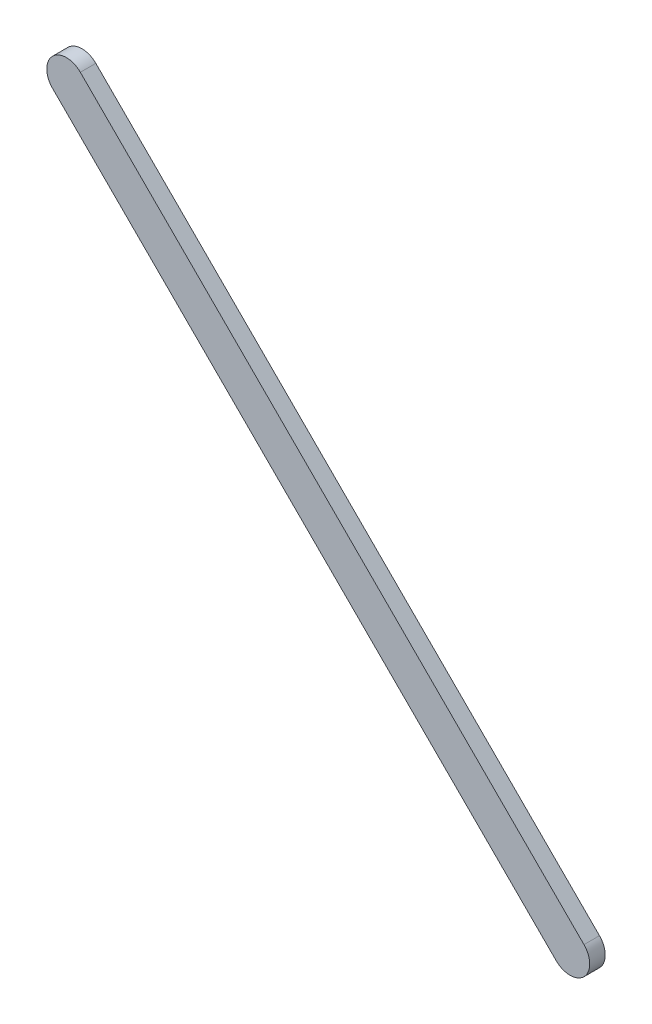
ISO-10303-21;
HEADER;
FILE_DESCRIPTION(('STEP AP214'),'2;1');
FILE_NAME('part.step','',(''),(''),'','','');
FILE_SCHEMA(('AUTOMOTIVE_DESIGN { 1 0 10303 214 1 1 1 1 }'));
ENDSEC;
DATA;
#1=APPLICATION_CONTEXT('core data for automotive mechanical design processes');
#2=APPLICATION_PROTOCOL_DEFINITION('international standard','automotive_design',2000,#1);
#3=PRODUCT_CONTEXT('',#1,'mechanical');
#4=PRODUCT('Part','Part','',(#3));
#5=PRODUCT_RELATED_PRODUCT_CATEGORY('part','',(#4));
#6=PRODUCT_DEFINITION_FORMATION('','',#4);
#7=PRODUCT_DEFINITION_CONTEXT('part definition',#1,'design');
#8=PRODUCT_DEFINITION('design','',#6,#7);
#9=PRODUCT_DEFINITION_SHAPE('','',#8);
#10=(LENGTH_UNIT() NAMED_UNIT(*) SI_UNIT(.MILLI.,.METRE.));
#11=(NAMED_UNIT(*) PLANE_ANGLE_UNIT() SI_UNIT($,.RADIAN.));
#12=(NAMED_UNIT(*) SI_UNIT($,.STERADIAN.) SOLID_ANGLE_UNIT());
#13=UNCERTAINTY_MEASURE_WITH_UNIT(LENGTH_MEASURE(1.E-05),#10,'distance_accuracy_value','');
#14=(GEOMETRIC_REPRESENTATION_CONTEXT(3) GLOBAL_UNCERTAINTY_ASSIGNED_CONTEXT((#13)) GLOBAL_UNIT_ASSIGNED_CONTEXT((#10,
#11,#12)) REPRESENTATION_CONTEXT('',''));
#15=CARTESIAN_POINT('',(0.,0.,0.));
#16=DIRECTION('',(0.,0.,1.));
#17=DIRECTION('',(1.,0.,0.));
#18=AXIS2_PLACEMENT_3D('',#15,#16,#17);
#19=CARTESIAN_POINT('',(136.569323,103.57939406,0.));
#20=DIRECTION('',(0.707106781186548,0.707106781186547,0.));
#21=DIRECTION('',(0.707106781186547,-0.707106781186548,0.));
#22=AXIS2_PLACEMENT_3D('',#19,#20,#21);
#23=PLANE('',#22);
#24=DIRECTION('',(0.707106781186547,-0.707106781186548,0.));
#25=VECTOR('',#24,1.);
#26=CARTESIAN_POINT('',(136.569323,103.57939406,0.1999996));
#27=LINE('',#26,#25);
#28=CARTESIAN_POINT('',(136.569323,103.57939406,0.1999996));
#29=VERTEX_POINT('',#28);
#30=CARTESIAN_POINT('',(143.07639406,97.072323,0.1999996));
#31=VERTEX_POINT('',#30);
#32=EDGE_CURVE('E11',#29,#31,#27,.T.);
#33=ORIENTED_EDGE('',*,*,#32,.F.);
#34=DIRECTION('',(0.,0.,1.));
#35=VECTOR('',#34,1.);
#36=CARTESIAN_POINT('',(136.569323,103.57939406,0.));
#37=LINE('',#36,#35);
#38=CARTESIAN_POINT('',(136.569323,103.57939406,0.));
#39=VERTEX_POINT('',#38);
#40=EDGE_CURVE('E24',#39,#29,#37,.T.);
#41=ORIENTED_EDGE('',*,*,#40,.F.);
#42=DIRECTION('',(0.707106781186547,-0.707106781186548,0.));
#43=VECTOR('',#42,1.);
#44=CARTESIAN_POINT('',(136.569323,103.57939406,0.));
#45=LINE('',#44,#43);
#46=CARTESIAN_POINT('',(143.07639406,97.072323,0.));
#47=VERTEX_POINT('',#46);
#48=EDGE_CURVE('E75',#39,#47,#45,.T.);
#49=ORIENTED_EDGE('',*,*,#48,.T.);
#50=DIRECTION('',(0.,0.,1.));
#51=VECTOR('',#50,1.);
#52=CARTESIAN_POINT('',(143.07639406,97.072323,0.));
#53=LINE('',#52,#51);
#54=EDGE_CURVE('E37',#47,#31,#53,.T.);
#55=ORIENTED_EDGE('',*,*,#54,.T.);
#56=EDGE_LOOP('',(#33,#41,#49,#55));
#57=FACE_BOUND('',#56,.T.);
#58=ADVANCED_FACE('F17',(#57),#23,.F.);
#59=CARTESIAN_POINT('',(143.25599873,97.25192767,0.));
#60=DIRECTION('',(0.,0.,-1.));
#61=DIRECTION('',(-0.707106781186548,-0.707106781186548,0.));
#62=AXIS2_PLACEMENT_3D('',#59,#60,#61);
#63=CYLINDRICAL_SURFACE('',#62,0.253999360179549);
#64=CARTESIAN_POINT('',(143.25599873,97.25192767,0.1999996));
#65=DIRECTION('',(0.,0.,1.));
#66=DIRECTION('',(-0.707106781186548,-0.707106781186548,0.));
#67=AXIS2_PLACEMENT_3D('',#64,#65,#66);
#68=CIRCLE('',#67,0.253999360179549);
#69=CARTESIAN_POINT('',(143.4356034,97.43153234,0.1999996));
#70=VERTEX_POINT('',#69);
#71=EDGE_CURVE('E83',#31,#70,#68,.T.);
#72=ORIENTED_EDGE('',*,*,#71,.F.);
#73=ORIENTED_EDGE('',*,*,#54,.F.);
#74=CARTESIAN_POINT('',(143.25599873,97.25192767,0.));
#75=DIRECTION('',(0.,0.,1.));
#76=DIRECTION('',(-0.707106781186548,-0.707106781186548,0.));
#77=AXIS2_PLACEMENT_3D('',#74,#75,#76);
#78=CIRCLE('',#77,0.253999360179549);
#79=CARTESIAN_POINT('',(143.4356034,97.43153234,0.));
#80=VERTEX_POINT('',#79);
#81=EDGE_CURVE('E81',#47,#80,#78,.T.);
#82=ORIENTED_EDGE('',*,*,#81,.T.);
#83=DIRECTION('',(0.,0.,1.));
#84=VECTOR('',#83,1.);
#85=CARTESIAN_POINT('',(143.4356034,97.43153234,0.));
#86=LINE('',#85,#84);
#87=EDGE_CURVE('E67',#80,#70,#86,.T.);
#88=ORIENTED_EDGE('',*,*,#87,.T.);
#89=EDGE_LOOP('',(#72,#73,#82,#88));
#90=FACE_BOUND('',#89,.T.);
#91=ADVANCED_FACE('F89',(#90),#63,.T.);
#92=CARTESIAN_POINT('',(143.4356034,97.43153234,0.));
#93=DIRECTION('',(-0.707106781186547,-0.707106781186548,0.));
#94=DIRECTION('',(-0.707106781186548,0.707106781186547,0.));
#95=AXIS2_PLACEMENT_3D('',#92,#93,#94);
#96=PLANE('',#95);
#97=DIRECTION('',(-0.707106781186548,0.707106781186547,0.));
#98=VECTOR('',#97,1.);
#99=CARTESIAN_POINT('',(143.4356034,97.43153234,0.1999996));
#100=LINE('',#99,#98);
#101=CARTESIAN_POINT('',(136.92853234,103.9386034,0.1999996));
#102=VERTEX_POINT('',#101);
#103=EDGE_CURVE('E71',#70,#102,#100,.T.);
#104=ORIENTED_EDGE('',*,*,#103,.F.);
#105=ORIENTED_EDGE('',*,*,#87,.F.);
#106=DIRECTION('',(-0.707106781186548,0.707106781186547,0.));
#107=VECTOR('',#106,1.);
#108=CARTESIAN_POINT('',(143.4356034,97.43153234,0.));
#109=LINE('',#108,#107);
#110=CARTESIAN_POINT('',(136.92853234,103.9386034,0.));
#111=VERTEX_POINT('',#110);
#112=EDGE_CURVE('E63',#80,#111,#109,.T.);
#113=ORIENTED_EDGE('',*,*,#112,.T.);
#114=DIRECTION('',(0.,0.,1.));
#115=VECTOR('',#114,1.);
#116=CARTESIAN_POINT('',(136.92853234,103.9386034,0.));
#117=LINE('',#116,#115);
#118=EDGE_CURVE('E53',#111,#102,#117,.T.);
#119=ORIENTED_EDGE('',*,*,#118,.T.);
#120=EDGE_LOOP('',(#104,#105,#113,#119));
#121=FACE_BOUND('',#120,.T.);
#122=ADVANCED_FACE('F66',(#121),#96,.F.);
#123=CARTESIAN_POINT('',(136.74892767,103.75899873,0.));
#124=DIRECTION('',(0.,0.,-1.));
#125=DIRECTION('',(0.707106781186492,0.707106781186603,0.));
#126=AXIS2_PLACEMENT_3D('',#123,#124,#125);
#127=CYLINDRICAL_SURFACE('',#126,0.253999360179542);
#128=CARTESIAN_POINT('',(136.74892767,103.75899873,0.1999996));
#129=DIRECTION('',(0.,0.,1.));
#130=DIRECTION('',(0.707106781186492,0.707106781186603,0.));
#131=AXIS2_PLACEMENT_3D('',#128,#129,#130);
#132=CIRCLE('',#131,0.253999360179542);
#133=EDGE_CURVE('E59',#102,#29,#132,.T.);
#134=ORIENTED_EDGE('',*,*,#133,.F.);
#135=ORIENTED_EDGE('',*,*,#118,.F.);
#136=CARTESIAN_POINT('',(136.74892767,103.75899873,0.));
#137=DIRECTION('',(0.,0.,1.));
#138=DIRECTION('',(0.707106781186492,0.707106781186603,0.));
#139=AXIS2_PLACEMENT_3D('',#136,#137,#138);
#140=CIRCLE('',#139,0.253999360179542);
#141=EDGE_CURVE('E57',#111,#39,#140,.T.);
#142=ORIENTED_EDGE('',*,*,#141,.T.);
#143=ORIENTED_EDGE('',*,*,#40,.T.);
#144=EDGE_LOOP('',(#134,#135,#142,#143));
#145=FACE_BOUND('',#144,.T.);
#146=ADVANCED_FACE('F55',(#145),#127,.T.);
#147=CARTESIAN_POINT('',(136.569323,103.57939406,0.));
#148=DIRECTION('',(0.,0.,-1.));
#149=DIRECTION('',(-1.,0.,0.));
#150=AXIS2_PLACEMENT_3D('',#147,#148,#149);
#151=PLANE('',#150);
#152=ORIENTED_EDGE('',*,*,#141,.F.);
#153=ORIENTED_EDGE('',*,*,#112,.F.);
#154=ORIENTED_EDGE('',*,*,#81,.F.);
#155=ORIENTED_EDGE('',*,*,#48,.F.);
#156=EDGE_LOOP('',(#152,#153,#154,#155));
#157=FACE_BOUND('',#156,.T.);
#158=ADVANCED_FACE('F74',(#157),#151,.T.);
#159=CARTESIAN_POINT('',(136.569323,103.57939406,0.1999996));
#160=DIRECTION('',(0.,0.,-1.));
#161=DIRECTION('',(-1.,0.,0.));
#162=AXIS2_PLACEMENT_3D('',#159,#160,#161);
#163=PLANE('',#162);
#164=ORIENTED_EDGE('',*,*,#32,.T.);
#165=ORIENTED_EDGE('',*,*,#71,.T.);
#166=ORIENTED_EDGE('',*,*,#103,.T.);
#167=ORIENTED_EDGE('',*,*,#133,.T.);
#168=EDGE_LOOP('',(#164,#165,#166,#167));
#169=FACE_BOUND('',#168,.T.);
#170=ADVANCED_FACE('F91',(#169),#163,.F.);
#171=CLOSED_SHELL('',(#58,#91,#122,#146,#158,#170));
#172=MANIFOLD_SOLID_BREP('B1',#171);
#173=ADVANCED_BREP_SHAPE_REPRESENTATION('',(#18,#172),#14);
#174=SHAPE_DEFINITION_REPRESENTATION(#9,#173);
ENDSEC;
END-ISO-10303-21;
